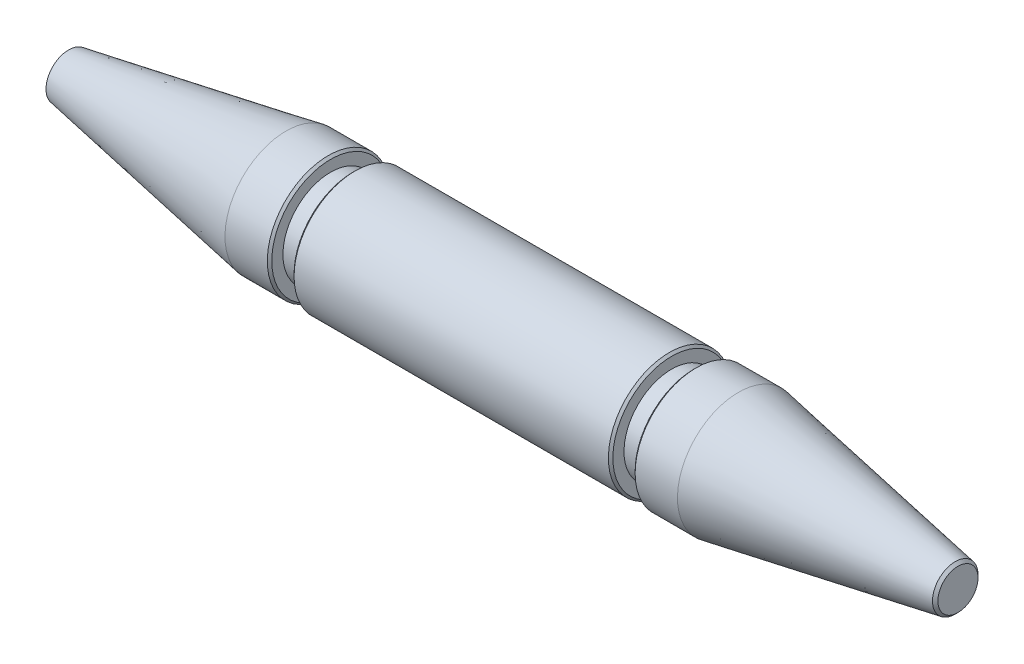
ISO-10303-21;
HEADER;
FILE_DESCRIPTION(('STEP AP214'),'2;1');
FILE_NAME('part.step','',(''),(''),'','','');
FILE_SCHEMA(('AUTOMOTIVE_DESIGN { 1 0 10303 214 1 1 1 1 }'));
ENDSEC;
DATA;
#1=APPLICATION_CONTEXT('core data for automotive mechanical design processes');
#2=APPLICATION_PROTOCOL_DEFINITION('international standard','automotive_design',2000,#1);
#3=PRODUCT_CONTEXT('',#1,'mechanical');
#4=PRODUCT('Part','Part','',(#3));
#5=PRODUCT_RELATED_PRODUCT_CATEGORY('part','',(#4));
#6=PRODUCT_DEFINITION_FORMATION('','',#4);
#7=PRODUCT_DEFINITION_CONTEXT('part definition',#1,'design');
#8=PRODUCT_DEFINITION('design','',#6,#7);
#9=PRODUCT_DEFINITION_SHAPE('','',#8);
#10=(LENGTH_UNIT() NAMED_UNIT(*) SI_UNIT(.MILLI.,.METRE.));
#11=(NAMED_UNIT(*) PLANE_ANGLE_UNIT() SI_UNIT($,.RADIAN.));
#12=(NAMED_UNIT(*) SI_UNIT($,.STERADIAN.) SOLID_ANGLE_UNIT());
#13=UNCERTAINTY_MEASURE_WITH_UNIT(LENGTH_MEASURE(1.E-05),#10,'distance_accuracy_value','');
#14=(GEOMETRIC_REPRESENTATION_CONTEXT(3) GLOBAL_UNCERTAINTY_ASSIGNED_CONTEXT((#13)) GLOBAL_UNIT_ASSIGNED_CONTEXT((#10,
#11,#12)) REPRESENTATION_CONTEXT('',''));
#15=CARTESIAN_POINT('',(0.,0.,0.));
#16=DIRECTION('',(0.,0.,1.));
#17=DIRECTION('',(1.,0.,0.));
#18=AXIS2_PLACEMENT_3D('',#15,#16,#17);
#19=CARTESIAN_POINT('',(-100.,0.,0.));
#20=DIRECTION('',(1.,0.,0.));
#21=DIRECTION('',(0.,1.,0.));
#22=AXIS2_PLACEMENT_3D('',#19,#20,#21);
#23=PLANE('',#22);
#24=CARTESIAN_POINT('',(-100.,0.,0.));
#25=DIRECTION('',(1.,0.,0.));
#26=DIRECTION('',(0.,1.,0.));
#27=AXIS2_PLACEMENT_3D('',#24,#25,#26);
#28=CIRCLE('',#27,4.38359847408923);
#29=CARTESIAN_POINT('',(-100.,4.38359847408923,0.));
#30=VERTEX_POINT('',#29);
#31=EDGE_CURVE('E52',#30,#30,#28,.F.);
#32=ORIENTED_EDGE('',*,*,#31,.T.);
#33=EDGE_LOOP('',(#32));
#34=FACE_BOUND('',#33,.T.);
#35=ADVANCED_FACE('F36',(#34),#23,.F.);
#36=CARTESIAN_POINT('',(-50.7596123493896,0.,0.));
#37=DIRECTION('',(1.,0.,0.));
#38=DIRECTION('',(0.,1.,0.));
#39=AXIS2_PLACEMENT_3D('',#36,#37,#38);
#40=CONICAL_SURFACE('',#39,13.6824088833466,0.174532925199434);
#41=CARTESIAN_POINT('',(-99.5075961234939,0.,0.));
#42=DIRECTION('',(-1.,0.,0.));
#43=DIRECTION('',(0.,-1.,0.));
#44=AXIS2_PLACEMENT_3D('',#41,#42,#43);
#45=CIRCLE('',#44,5.08682408883346);
#46=CARTESIAN_POINT('',(-99.5075961234939,-5.08682408883346,0.));
#47=VERTEX_POINT('',#46);
#48=EDGE_CURVE('E48',#47,#47,#45,.F.);
#49=ORIENTED_EDGE('',*,*,#48,.T.);
#50=EDGE_LOOP('',(#49));
#51=FACE_BOUND('',#50,.T.);
#52=CARTESIAN_POINT('',(-50.7596123493896,0.,0.));
#53=DIRECTION('',(-1.,0.,0.));
#54=DIRECTION('',(0.,-1.,0.));
#55=AXIS2_PLACEMENT_3D('',#52,#53,#54);
#56=CIRCLE('',#55,13.6824088833466);
#57=CARTESIAN_POINT('',(-50.7596123493896,-13.6824088833465,0.));
#58=VERTEX_POINT('',#57);
#59=EDGE_CURVE('E81',#58,#58,#56,.T.);
#60=ORIENTED_EDGE('',*,*,#59,.T.);
#61=EDGE_LOOP('',(#60));
#62=FACE_BOUND('',#61,.T.);
#63=ADVANCED_FACE('F116',(#51,#62),#40,.T.);
#64=CARTESIAN_POINT('',(-100.,0.,0.));
#65=DIRECTION('',(-1.,0.,0.));
#66=DIRECTION('',(0.,-1.,0.));
#67=AXIS2_PLACEMENT_3D('',#64,#65,#66);
#68=CYLINDRICAL_SURFACE('',#67,13.6824088833466);
#69=CARTESIAN_POINT('',(-41.2596123493896,0.,0.));
#70=DIRECTION('',(-1.,0.,0.));
#71=DIRECTION('',(0.,-1.,0.));
#72=AXIS2_PLACEMENT_3D('',#69,#70,#71);
#73=CIRCLE('',#72,13.6824088833466);
#74=CARTESIAN_POINT('',(-41.2596123493896,-13.6824088833465,0.));
#75=VERTEX_POINT('',#74);
#76=EDGE_CURVE('E69',#75,#75,#73,.T.);
#77=ORIENTED_EDGE('',*,*,#76,.T.);
#78=EDGE_LOOP('',(#77));
#79=FACE_BOUND('',#78,.T.);
#80=ORIENTED_EDGE('',*,*,#59,.F.);
#81=EDGE_LOOP('',(#80));
#82=FACE_BOUND('',#81,.T.);
#83=ADVANCED_FACE('F122',(#79,#82),#68,.T.);
#84=CARTESIAN_POINT('',(-40.7596123493896,13.6824088833466,0.));
#85=DIRECTION('',(-1.,0.,0.));
#86=DIRECTION('',(0.,-1.,0.));
#87=AXIS2_PLACEMENT_3D('',#84,#85,#86);
#88=PLANE('',#87);
#89=CARTESIAN_POINT('',(-40.7596123493896,0.,0.));
#90=DIRECTION('',(-1.,0.,0.));
#91=DIRECTION('',(0.,-1.,0.));
#92=AXIS2_PLACEMENT_3D('',#89,#90,#91);
#93=CIRCLE('',#92,13.1824088833466);
#94=CARTESIAN_POINT('',(-40.7596123493896,-13.1824088833466,0.));
#95=VERTEX_POINT('',#94);
#96=EDGE_CURVE('E66',#95,#95,#93,.F.);
#97=ORIENTED_EDGE('',*,*,#96,.T.);
#98=EDGE_LOOP('',(#97));
#99=FACE_BOUND('',#98,.T.);
#100=CARTESIAN_POINT('',(-40.7596123493896,0.,0.));
#101=DIRECTION('',(-1.,0.,0.));
#102=DIRECTION('',(0.,-1.,0.));
#103=AXIS2_PLACEMENT_3D('',#100,#101,#102);
#104=CIRCLE('',#103,10.6824088833466);
#105=CARTESIAN_POINT('',(-40.7596123493896,-10.6824088833465,0.));
#106=VERTEX_POINT('',#105);
#107=EDGE_CURVE('E84',#106,#106,#104,.T.);
#108=ORIENTED_EDGE('',*,*,#107,.T.);
#109=EDGE_LOOP('',(#108));
#110=FACE_BOUND('',#109,.T.);
#111=ADVANCED_FACE('F170',(#99,#110),#88,.F.);
#112=CARTESIAN_POINT('',(-100.,0.,0.));
#113=DIRECTION('',(-1.,0.,0.));
#114=DIRECTION('',(0.,-1.,0.));
#115=AXIS2_PLACEMENT_3D('',#112,#113,#114);
#116=CYLINDRICAL_SURFACE('',#115,10.6824088833466);
#117=ORIENTED_EDGE('',*,*,#107,.F.);
#118=EDGE_LOOP('',(#117));
#119=FACE_BOUND('',#118,.T.);
#120=CARTESIAN_POINT('',(-35.7596123493896,0.,0.));
#121=DIRECTION('',(-1.,0.,0.));
#122=DIRECTION('',(0.,-1.,0.));
#123=AXIS2_PLACEMENT_3D('',#120,#121,#122);
#124=CIRCLE('',#123,10.6824088833466);
#125=CARTESIAN_POINT('',(-35.7596123493896,-10.6824088833465,0.));
#126=VERTEX_POINT('',#125);
#127=EDGE_CURVE('E87',#126,#126,#124,.T.);
#128=ORIENTED_EDGE('',*,*,#127,.T.);
#129=EDGE_LOOP('',(#128));
#130=FACE_BOUND('',#129,.T.);
#131=ADVANCED_FACE('F175',(#119,#130),#116,.T.);
#132=CARTESIAN_POINT('',(-35.7596123493896,10.6824088833466,0.));
#133=DIRECTION('',(1.,0.,0.));
#134=DIRECTION('',(0.,1.,0.));
#135=AXIS2_PLACEMENT_3D('',#132,#133,#134);
#136=PLANE('',#135);
#137=CARTESIAN_POINT('',(-35.7596123493896,0.,0.));
#138=DIRECTION('',(1.,0.,0.));
#139=DIRECTION('',(0.,1.,0.));
#140=AXIS2_PLACEMENT_3D('',#137,#138,#139);
#141=CIRCLE('',#140,13.1824088833466);
#142=CARTESIAN_POINT('',(-35.7596123493896,13.1824088833466,0.));
#143=VERTEX_POINT('',#142);
#144=EDGE_CURVE('E78',#143,#143,#141,.F.);
#145=ORIENTED_EDGE('',*,*,#144,.T.);
#146=EDGE_LOOP('',(#145));
#147=FACE_BOUND('',#146,.T.);
#148=ORIENTED_EDGE('',*,*,#127,.F.);
#149=EDGE_LOOP('',(#148));
#150=FACE_BOUND('',#149,.T.);
#151=ADVANCED_FACE('F181',(#147,#150),#136,.F.);
#152=CARTESIAN_POINT('',(-100.,0.,0.));
#153=DIRECTION('',(-1.,0.,0.));
#154=DIRECTION('',(0.,-1.,0.));
#155=AXIS2_PLACEMENT_3D('',#152,#153,#154);
#156=CYLINDRICAL_SURFACE('',#155,13.6824088833465);
#157=CARTESIAN_POINT('',(-35.2596123493896,0.,0.));
#158=DIRECTION('',(1.,0.,0.));
#159=DIRECTION('',(0.,1.,0.));
#160=AXIS2_PLACEMENT_3D('',#157,#158,#159);
#161=CIRCLE('',#160,13.6824088833465);
#162=CARTESIAN_POINT('',(-35.2596123493896,13.6824088833466,0.));
#163=VERTEX_POINT('',#162);
#164=EDGE_CURVE('E72',#163,#163,#161,.T.);
#165=ORIENTED_EDGE('',*,*,#164,.T.);
#166=EDGE_LOOP('',(#165));
#167=FACE_BOUND('',#166,.T.);
#168=CARTESIAN_POINT('',(35.2596123493896,0.,0.));
#169=DIRECTION('',(-1.,0.,0.));
#170=DIRECTION('',(0.,-1.,0.));
#171=AXIS2_PLACEMENT_3D('',#168,#169,#170);
#172=CIRCLE('',#171,13.6824088833465);
#173=CARTESIAN_POINT('',(35.2596123493896,-13.6824088833465,0.));
#174=VERTEX_POINT('',#173);
#175=EDGE_CURVE('E75',#174,#174,#172,.T.);
#176=ORIENTED_EDGE('',*,*,#175,.T.);
#177=EDGE_LOOP('',(#176));
#178=FACE_BOUND('',#177,.T.);
#179=ADVANCED_FACE('F185',(#167,#178),#156,.T.);
#180=CARTESIAN_POINT('',(35.7596123493896,10.6824088833466,0.));
#181=DIRECTION('',(-1.,0.,0.));
#182=DIRECTION('',(0.,-1.,0.));
#183=AXIS2_PLACEMENT_3D('',#180,#181,#182);
#184=PLANE('',#183);
#185=CARTESIAN_POINT('',(35.7596123493896,0.,0.));
#186=DIRECTION('',(-1.,0.,0.));
#187=DIRECTION('',(0.,-1.,0.));
#188=AXIS2_PLACEMENT_3D('',#185,#186,#187);
#189=CIRCLE('',#188,13.1824088833465);
#190=CARTESIAN_POINT('',(35.7596123493896,-13.1824088833465,0.));
#191=VERTEX_POINT('',#190);
#192=EDGE_CURVE('E63',#191,#191,#189,.F.);
#193=ORIENTED_EDGE('',*,*,#192,.T.);
#194=EDGE_LOOP('',(#193));
#195=FACE_BOUND('',#194,.T.);
#196=CARTESIAN_POINT('',(35.7596123493896,0.,0.));
#197=DIRECTION('',(-1.,0.,0.));
#198=DIRECTION('',(0.,-1.,0.));
#199=AXIS2_PLACEMENT_3D('',#196,#197,#198);
#200=CIRCLE('',#199,10.6824088833465);
#201=CARTESIAN_POINT('',(35.7596123493896,-10.6824088833465,0.));
#202=VERTEX_POINT('',#201);
#203=EDGE_CURVE('E90',#202,#202,#200,.T.);
#204=ORIENTED_EDGE('',*,*,#203,.T.);
#205=EDGE_LOOP('',(#204));
#206=FACE_BOUND('',#205,.T.);
#207=ADVANCED_FACE('F189',(#195,#206),#184,.F.);
#208=CARTESIAN_POINT('',(-100.,0.,0.));
#209=DIRECTION('',(-1.,0.,0.));
#210=DIRECTION('',(0.,-1.,0.));
#211=AXIS2_PLACEMENT_3D('',#208,#209,#210);
#212=CYLINDRICAL_SURFACE('',#211,10.6824088833465);
#213=ORIENTED_EDGE('',*,*,#203,.F.);
#214=EDGE_LOOP('',(#213));
#215=FACE_BOUND('',#214,.T.);
#216=CARTESIAN_POINT('',(40.7596123493896,0.,0.));
#217=DIRECTION('',(-1.,0.,0.));
#218=DIRECTION('',(0.,-1.,0.));
#219=AXIS2_PLACEMENT_3D('',#216,#217,#218);
#220=CIRCLE('',#219,10.6824088833465);
#221=CARTESIAN_POINT('',(40.7596123493896,-10.6824088833465,0.));
#222=VERTEX_POINT('',#221);
#223=EDGE_CURVE('E93',#222,#222,#220,.T.);
#224=ORIENTED_EDGE('',*,*,#223,.T.);
#225=EDGE_LOOP('',(#224));
#226=FACE_BOUND('',#225,.T.);
#227=ADVANCED_FACE('F193',(#215,#226),#212,.T.);
#228=CARTESIAN_POINT('',(40.7596123493896,13.6824088833466,0.));
#229=DIRECTION('',(1.,0.,0.));
#230=DIRECTION('',(0.,1.,0.));
#231=AXIS2_PLACEMENT_3D('',#228,#229,#230);
#232=PLANE('',#231);
#233=CARTESIAN_POINT('',(40.7596123493896,0.,0.));
#234=DIRECTION('',(1.,0.,0.));
#235=DIRECTION('',(0.,1.,0.));
#236=AXIS2_PLACEMENT_3D('',#233,#234,#235);
#237=CIRCLE('',#236,13.1824088833466);
#238=CARTESIAN_POINT('',(40.7596123493896,13.1824088833466,0.));
#239=VERTEX_POINT('',#238);
#240=EDGE_CURVE('E60',#239,#239,#237,.F.);
#241=ORIENTED_EDGE('',*,*,#240,.T.);
#242=EDGE_LOOP('',(#241));
#243=FACE_BOUND('',#242,.T.);
#244=ORIENTED_EDGE('',*,*,#223,.F.);
#245=EDGE_LOOP('',(#244));
#246=FACE_BOUND('',#245,.T.);
#247=ADVANCED_FACE('F112',(#243,#246),#232,.F.);
#248=CARTESIAN_POINT('',(-100.,0.,0.));
#249=DIRECTION('',(-1.,0.,0.));
#250=DIRECTION('',(0.,-1.,0.));
#251=AXIS2_PLACEMENT_3D('',#248,#249,#250);
#252=CYLINDRICAL_SURFACE('',#251,13.6824088833465);
#253=CARTESIAN_POINT('',(41.2596123493896,0.,0.));
#254=DIRECTION('',(1.,0.,0.));
#255=DIRECTION('',(0.,1.,0.));
#256=AXIS2_PLACEMENT_3D('',#253,#254,#255);
#257=CIRCLE('',#256,13.6824088833465);
#258=CARTESIAN_POINT('',(41.2596123493896,13.6824088833466,0.));
#259=VERTEX_POINT('',#258);
#260=EDGE_CURVE('E57',#259,#259,#257,.T.);
#261=ORIENTED_EDGE('',*,*,#260,.T.);
#262=EDGE_LOOP('',(#261));
#263=FACE_BOUND('',#262,.T.);
#264=CARTESIAN_POINT('',(50.7596123493896,0.,0.));
#265=DIRECTION('',(-1.,0.,0.));
#266=DIRECTION('',(0.,-1.,0.));
#267=AXIS2_PLACEMENT_3D('',#264,#265,#266);
#268=CIRCLE('',#267,13.6824088833465);
#269=CARTESIAN_POINT('',(50.7596123493896,-13.6824088833465,0.));
#270=VERTEX_POINT('',#269);
#271=EDGE_CURVE('E96',#270,#270,#268,.T.);
#272=ORIENTED_EDGE('',*,*,#271,.T.);
#273=EDGE_LOOP('',(#272));
#274=FACE_BOUND('',#273,.T.);
#275=ADVANCED_FACE('F100',(#263,#274),#252,.T.);
#276=CARTESIAN_POINT('',(100.,0.,0.));
#277=DIRECTION('',(-1.,0.,0.));
#278=DIRECTION('',(0.,-1.,0.));
#279=AXIS2_PLACEMENT_3D('',#276,#277,#278);
#280=CONICAL_SURFACE('',#279,4.99999999999996,0.174532925199434);
#281=CARTESIAN_POINT('',(99.3929629983145,0.,0.));
#282=DIRECTION('',(1.,0.,0.));
#283=DIRECTION('',(0.,1.,0.));
#284=AXIS2_PLACEMENT_3D('',#281,#282,#283);
#285=CIRCLE('',#284,5.10703700168549);
#286=CARTESIAN_POINT('',(99.3929629983145,5.10703700168553,0.));
#287=VERTEX_POINT('',#286);
#288=EDGE_CURVE('E44',#287,#287,#285,.F.);
#289=ORIENTED_EDGE('',*,*,#288,.T.);
#290=EDGE_LOOP('',(#289));
#291=FACE_BOUND('',#290,.T.);
#292=ORIENTED_EDGE('',*,*,#271,.F.);
#293=EDGE_LOOP('',(#292));
#294=FACE_BOUND('',#293,.T.);
#295=ADVANCED_FACE('F102',(#291,#294),#280,.T.);
#296=CARTESIAN_POINT('',(100.,0.,0.));
#297=DIRECTION('',(-1.,0.,0.));
#298=DIRECTION('',(0.,-1.,0.));
#299=AXIS2_PLACEMENT_3D('',#296,#297,#298);
#300=PLANE('',#299);
#301=CARTESIAN_POINT('',(100.,0.,0.));
#302=DIRECTION('',(-1.,0.,0.));
#303=DIRECTION('',(0.,-1.,0.));
#304=AXIS2_PLACEMENT_3D('',#301,#302,#303);
#305=CIRCLE('',#304,4.49999999999995);
#306=CARTESIAN_POINT('',(100.,-4.49999999999991,0.));
#307=VERTEX_POINT('',#306);
#308=EDGE_CURVE('E10',#307,#307,#305,.F.);
#309=ORIENTED_EDGE('',*,*,#308,.T.);
#310=EDGE_LOOP('',(#309));
#311=FACE_BOUND('',#310,.T.);
#312=ADVANCED_FACE('F104',(#311),#300,.F.);
#313=CARTESIAN_POINT('',(-35.7596123493896,0.,0.));
#314=DIRECTION('',(1.,0.,0.));
#315=DIRECTION('',(0.,1.,0.));
#316=AXIS2_PLACEMENT_3D('',#313,#314,#315);
#317=CONICAL_SURFACE('',#316,13.1824088833466,0.785398163397457);
#318=ORIENTED_EDGE('',*,*,#164,.F.);
#319=EDGE_LOOP('',(#318));
#320=FACE_BOUND('',#319,.T.);
#321=ORIENTED_EDGE('',*,*,#144,.F.);
#322=EDGE_LOOP('',(#321));
#323=FACE_BOUND('',#322,.T.);
#324=ADVANCED_FACE('F110',(#320,#323),#317,.T.);
#325=CARTESIAN_POINT('',(-41.2596123493896,0.,0.));
#326=DIRECTION('',(-1.,0.,0.));
#327=DIRECTION('',(0.,-1.,0.));
#328=AXIS2_PLACEMENT_3D('',#325,#326,#327);
#329=CONICAL_SURFACE('',#328,13.6824088833466,0.785398163397459);
#330=ORIENTED_EDGE('',*,*,#96,.F.);
#331=EDGE_LOOP('',(#330));
#332=FACE_BOUND('',#331,.T.);
#333=ORIENTED_EDGE('',*,*,#76,.F.);
#334=EDGE_LOOP('',(#333));
#335=FACE_BOUND('',#334,.T.);
#336=ADVANCED_FACE('F133',(#332,#335),#329,.T.);
#337=CARTESIAN_POINT('',(35.2596123493896,0.,0.));
#338=DIRECTION('',(-1.,0.,0.));
#339=DIRECTION('',(0.,-1.,0.));
#340=AXIS2_PLACEMENT_3D('',#337,#338,#339);
#341=CONICAL_SURFACE('',#340,13.6824088833465,0.785398163397429);
#342=ORIENTED_EDGE('',*,*,#192,.F.);
#343=EDGE_LOOP('',(#342));
#344=FACE_BOUND('',#343,.T.);
#345=ORIENTED_EDGE('',*,*,#175,.F.);
#346=EDGE_LOOP('',(#345));
#347=FACE_BOUND('',#346,.T.);
#348=ADVANCED_FACE('F140',(#344,#347),#341,.T.);
#349=CARTESIAN_POINT('',(40.7596123493896,0.,0.));
#350=DIRECTION('',(1.,0.,0.));
#351=DIRECTION('',(0.,1.,0.));
#352=AXIS2_PLACEMENT_3D('',#349,#350,#351);
#353=CONICAL_SURFACE('',#352,13.1824088833466,0.785398163397421);
#354=ORIENTED_EDGE('',*,*,#260,.F.);
#355=EDGE_LOOP('',(#354));
#356=FACE_BOUND('',#355,.T.);
#357=ORIENTED_EDGE('',*,*,#240,.F.);
#358=EDGE_LOOP('',(#357));
#359=FACE_BOUND('',#358,.T.);
#360=ADVANCED_FACE('F147',(#356,#359),#353,.T.);
#361=CARTESIAN_POINT('',(-100.,0.,0.));
#362=DIRECTION('',(1.,0.,0.));
#363=DIRECTION('',(0.,1.,0.));
#364=AXIS2_PLACEMENT_3D('',#361,#362,#363);
#365=CONICAL_SURFACE('',#364,4.38359847408923,0.959931088596868);
#366=ORIENTED_EDGE('',*,*,#48,.F.);
#367=EDGE_LOOP('',(#366));
#368=FACE_BOUND('',#367,.T.);
#369=ORIENTED_EDGE('',*,*,#31,.F.);
#370=EDGE_LOOP('',(#369));
#371=FACE_BOUND('',#370,.T.);
#372=ADVANCED_FACE('F153',(#368,#371),#365,.T.);
#373=CARTESIAN_POINT('',(99.3929629983145,0.,0.));
#374=DIRECTION('',(-1.,0.,0.));
#375=DIRECTION('',(0.,-1.,0.));
#376=AXIS2_PLACEMENT_3D('',#373,#374,#375);
#377=CONICAL_SURFACE('',#376,5.10703700168549,0.78539816339746);
#378=ORIENTED_EDGE('',*,*,#308,.F.);
#379=EDGE_LOOP('',(#378));
#380=FACE_BOUND('',#379,.T.);
#381=ORIENTED_EDGE('',*,*,#288,.F.);
#382=EDGE_LOOP('',(#381));
#383=FACE_BOUND('',#382,.T.);
#384=ADVANCED_FACE('F39',(#380,#383),#377,.T.);
#385=CLOSED_SHELL('',(#35,#63,#83,#111,#131,#151,#179,#207,#227,#247,#275,#295,#312,#324,#336,
#348,#360,#372,#384));
#386=MANIFOLD_SOLID_BREP('B2',#385);
#387=ADVANCED_BREP_SHAPE_REPRESENTATION('',(#18,#386),#14);
#388=SHAPE_DEFINITION_REPRESENTATION(#9,#387);
ENDSEC;
END-ISO-10303-21;
